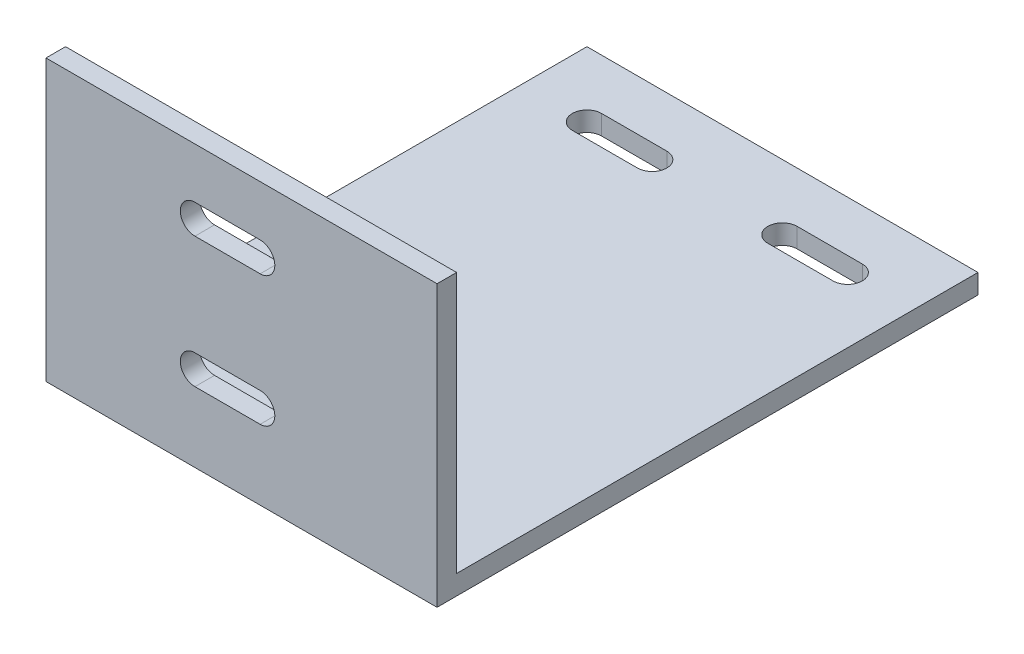
ISO-10303-21;
HEADER;
FILE_DESCRIPTION(('STEP AP214'),'2;1');
FILE_NAME('part.step','',(''),(''),'','','');
FILE_SCHEMA(('AUTOMOTIVE_DESIGN { 1 0 10303 214 1 1 1 1 }'));
ENDSEC;
DATA;
#1=APPLICATION_CONTEXT('core data for automotive mechanical design processes');
#2=APPLICATION_PROTOCOL_DEFINITION('international standard','automotive_design',2000,#1);
#3=PRODUCT_CONTEXT('',#1,'mechanical');
#4=PRODUCT('Part','Part','',(#3));
#5=PRODUCT_RELATED_PRODUCT_CATEGORY('part','',(#4));
#6=PRODUCT_DEFINITION_FORMATION('','',#4);
#7=PRODUCT_DEFINITION_CONTEXT('part definition',#1,'design');
#8=PRODUCT_DEFINITION('design','',#6,#7);
#9=PRODUCT_DEFINITION_SHAPE('','',#8);
#10=(LENGTH_UNIT() NAMED_UNIT(*) SI_UNIT(.MILLI.,.METRE.));
#11=(NAMED_UNIT(*) PLANE_ANGLE_UNIT() SI_UNIT($,.RADIAN.));
#12=(NAMED_UNIT(*) SI_UNIT($,.STERADIAN.) SOLID_ANGLE_UNIT());
#13=UNCERTAINTY_MEASURE_WITH_UNIT(LENGTH_MEASURE(1.E-05),#10,'distance_accuracy_value','');
#14=(GEOMETRIC_REPRESENTATION_CONTEXT(3) GLOBAL_UNCERTAINTY_ASSIGNED_CONTEXT((#13)) GLOBAL_UNIT_ASSIGNED_CONTEXT((#10,
#11,#12)) REPRESENTATION_CONTEXT('',''));
#15=CARTESIAN_POINT('',(0.,0.,0.));
#16=DIRECTION('',(0.,0.,1.));
#17=DIRECTION('',(1.,0.,0.));
#18=AXIS2_PLACEMENT_3D('',#15,#16,#17);
#19=CARTESIAN_POINT('',(-55.71281292085,37.,-144.0000000001));
#20=DIRECTION('',(0.,-1.,0.));
#21=DIRECTION('',(-1.,0.,0.));
#22=AXIS2_PLACEMENT_3D('',#19,#20,#21);
#23=PLANE('',#22);
#24=DIRECTION('',(1.,0.,-4.806710585115E-13));
#25=VECTOR('',#24,1.);
#26=CARTESIAN_POINT('',(-15.71281292093,37.,-119.5000000001));
#27=LINE('',#26,#25);
#28=CARTESIAN_POINT('',(24.287187079079,37.,-119.5));
#29=VERTEX_POINT('',#28);
#30=CARTESIAN_POINT('',(44.287187079084,37.,-119.4999999999));
#31=VERTEX_POINT('',#30);
#32=EDGE_CURVE('E238',#29,#31,#27,.T.);
#33=ORIENTED_EDGE('',*,*,#32,.F.);
#34=CARTESIAN_POINT('',(24.287187078964,37.,-123.9999999997));
#35=DIRECTION('',(0.,1.,0.));
#36=DIRECTION('',(-4.806710585115E-13,0.,-1.));
#37=AXIS2_PLACEMENT_3D('',#34,#35,#36);
#38=CIRCLE('',#37,4.5);
#39=CARTESIAN_POINT('',(24.287187079204,37.,-128.5000000004));
#40=VERTEX_POINT('',#39);
#41=EDGE_CURVE('E235',#40,#29,#38,.T.);
#42=ORIENTED_EDGE('',*,*,#41,.F.);
#43=DIRECTION('',(-1.,0.,4.806710585115E-13));
#44=VECTOR('',#43,1.);
#45=CARTESIAN_POINT('',(-5.712812921062,37.,-128.4999999995));
#46=LINE('',#45,#44);
#47=CARTESIAN_POINT('',(44.287187079209,37.,-128.5000000003));
#48=VERTEX_POINT('',#47);
#49=EDGE_CURVE('E266',#48,#40,#46,.T.);
#50=ORIENTED_EDGE('',*,*,#49,.F.);
#51=CARTESIAN_POINT('',(44.287187078969,37.,-123.9999999996));
#52=DIRECTION('',(0.,1.,0.));
#53=DIRECTION('',(4.806710585115E-13,0.,1.));
#54=AXIS2_PLACEMENT_3D('',#51,#52,#53);
#55=CIRCLE('',#54,4.5);
#56=EDGE_CURVE('E267',#31,#48,#55,.T.);
#57=ORIENTED_EDGE('',*,*,#56,.F.);
#58=EDGE_LOOP('',(#33,#42,#50,#57));
#59=FACE_BOUND('',#58,.T.);
#60=DIRECTION('',(1.,0.,-4.806710585115E-13));
#61=VECTOR('',#60,1.);
#62=CARTESIAN_POINT('',(-45.71281292084,37.,-119.5000000001));
#63=LINE('',#62,#61);
#64=CARTESIAN_POINT('',(-35.71281292083,37.,-119.5000000001));
#65=VERTEX_POINT('',#64);
#66=CARTESIAN_POINT('',(-15.71281292093,37.,-119.5000000001));
#67=VERTEX_POINT('',#66);
#68=EDGE_CURVE('E21',#65,#67,#63,.T.);
#69=ORIENTED_EDGE('',*,*,#68,.F.);
#70=CARTESIAN_POINT('',(-35.71281292095,37.,-123.9999999998));
#71=DIRECTION('',(0.,1.,0.));
#72=DIRECTION('',(-4.806710585115E-13,0.,-1.));
#73=AXIS2_PLACEMENT_3D('',#70,#71,#72);
#74=CIRCLE('',#73,4.5);
#75=CARTESIAN_POINT('',(-35.71281292107,37.,-128.4999999995));
#76=VERTEX_POINT('',#75);
#77=EDGE_CURVE('E48',#76,#65,#74,.T.);
#78=ORIENTED_EDGE('',*,*,#77,.F.);
#79=DIRECTION('',(-1.,0.,4.806710585115E-13));
#80=VECTOR('',#79,1.);
#81=CARTESIAN_POINT('',(-35.71281292107,37.,-128.4999999995));
#82=LINE('',#81,#80);
#83=CARTESIAN_POINT('',(-15.71281292106,37.,-128.4999999995));
#84=VERTEX_POINT('',#83);
#85=EDGE_CURVE('E283',#84,#76,#82,.T.);
#86=ORIENTED_EDGE('',*,*,#85,.F.);
#87=CARTESIAN_POINT('',(-15.71281292095,37.,-123.9999999998));
#88=DIRECTION('',(0.,1.,0.));
#89=DIRECTION('',(4.806710585115E-13,0.,1.));
#90=AXIS2_PLACEMENT_3D('',#87,#88,#89);
#91=CIRCLE('',#90,4.5);
#92=EDGE_CURVE('E275',#67,#84,#91,.T.);
#93=ORIENTED_EDGE('',*,*,#92,.F.);
#94=EDGE_LOOP('',(#69,#78,#86,#93));
#95=FACE_BOUND('',#94,.T.);
#96=DIRECTION('',(-5.186961971049E-13,0.,1.));
#97=VECTOR('',#96,1.);
#98=CARTESIAN_POINT('',(64.287187078983,37.,-143.9999999998));
#99=LINE('',#98,#97);
#100=CARTESIAN_POINT('',(64.287187078982,37.,-143.9999999998));
#101=VERTEX_POINT('',#100);
#102=CARTESIAN_POINT('',(64.287187078899,37.,16.000000000441));
#103=VERTEX_POINT('',#102);
#104=EDGE_CURVE('E327',#101,#103,#99,.T.);
#105=ORIENTED_EDGE('',*,*,#104,.F.);
#106=DIRECTION('',(1.,0.,-4.806710585115E-13));
#107=VECTOR('',#106,1.);
#108=CARTESIAN_POINT('',(-55.71281292085,37.,-144.0000000001));
#109=LINE('',#108,#107);
#110=CARTESIAN_POINT('',(-55.71281292085,37.,-144.0000000001));
#111=VERTEX_POINT('',#110);
#112=EDGE_CURVE('E11',#111,#101,#109,.T.);
#113=ORIENTED_EDGE('',*,*,#112,.F.);
#114=DIRECTION('',(-1.662836535132E-13,0.,1.));
#115=VECTOR('',#114,1.);
#116=CARTESIAN_POINT('',(-55.71281292085,37.,-144.0000000001));
#117=LINE('',#116,#115);
#118=CARTESIAN_POINT('',(-55.71281292087,37.,-30.));
#119=VERTEX_POINT('',#118);
#120=EDGE_CURVE('E714',#111,#119,#117,.T.);
#121=ORIENTED_EDGE('',*,*,#120,.T.);
#122=DIRECTION('',(4.806710585115E-13,0.,1.));
#123=VECTOR('',#122,1.);
#124=CARTESIAN_POINT('',(-55.71281292085,37.,-104.0000000001));
#125=LINE('',#124,#123);
#126=CARTESIAN_POINT('',(-55.71281292093,37.,16.000000000171));
#127=VERTEX_POINT('',#126);
#128=EDGE_CURVE('E320',#119,#127,#125,.T.);
#129=ORIENTED_EDGE('',*,*,#128,.T.);
#130=DIRECTION('',(1.,0.,-4.806710585115E-13));
#131=VECTOR('',#130,1.);
#132=CARTESIAN_POINT('',(-55.71281292093,37.,16.000000000171));
#133=LINE('',#132,#131);
#134=EDGE_CURVE('E354',#127,#103,#133,.T.);
#135=ORIENTED_EDGE('',*,*,#134,.T.);
#136=EDGE_LOOP('',(#105,#113,#121,#129,#135));
#137=FACE_BOUND('',#136,.T.);
#138=ADVANCED_FACE('F17',(#59,#95,#137),#23,.F.);
#139=CARTESIAN_POINT('',(-55.71281292085,37.,-144.0000000001));
#140=DIRECTION('',(4.806710585115E-13,0.,1.));
#141=DIRECTION('',(1.,0.,-4.806710585115E-13));
#142=AXIS2_PLACEMENT_3D('',#139,#140,#141);
#143=PLANE('',#142);
#144=DIRECTION('',(0.,-1.,0.));
#145=VECTOR('',#144,1.);
#146=CARTESIAN_POINT('',(-55.71281292085,37.,-144.0000000001));
#147=LINE('',#146,#145);
#148=CARTESIAN_POINT('',(-55.71281292085,31.,-144.0000000001));
#149=VERTEX_POINT('',#148);
#150=EDGE_CURVE('E326',#111,#149,#147,.T.);
#151=ORIENTED_EDGE('',*,*,#150,.F.);
#152=ORIENTED_EDGE('',*,*,#112,.T.);
#153=DIRECTION('',(0.,-1.,0.));
#154=VECTOR('',#153,1.);
#155=CARTESIAN_POINT('',(64.287187078982,37.,-143.9999999998));
#156=LINE('',#155,#154);
#157=CARTESIAN_POINT('',(64.287187078982,31.,-143.9999999998));
#158=VERTEX_POINT('',#157);
#159=EDGE_CURVE('E331',#101,#158,#156,.T.);
#160=ORIENTED_EDGE('',*,*,#159,.T.);
#161=DIRECTION('',(1.,0.,-4.806710585115E-13));
#162=VECTOR('',#161,1.);
#163=CARTESIAN_POINT('',(-55.71281292085,31.,-144.0000000001));
#164=LINE('',#163,#162);
#165=EDGE_CURVE('E472',#149,#158,#164,.T.);
#166=ORIENTED_EDGE('',*,*,#165,.F.);
#167=EDGE_LOOP('',(#151,#152,#160,#166));
#168=FACE_BOUND('',#167,.T.);
#169=ADVANCED_FACE('F19',(#168),#143,.F.);
#170=CARTESIAN_POINT('',(-35.71281292083,30.99,-119.5000000001));
#171=DIRECTION('',(4.806710585115E-13,0.,1.));
#172=DIRECTION('',(1.,0.,-4.806710585115E-13));
#173=AXIS2_PLACEMENT_3D('',#170,#171,#172);
#174=PLANE('',#173);
#175=DIRECTION('',(1.,0.,-4.806710585115E-13));
#176=VECTOR('',#175,1.);
#177=CARTESIAN_POINT('',(-45.71281292084,31.,-119.5000000001));
#178=LINE('',#177,#176);
#179=CARTESIAN_POINT('',(-35.71281292083,31.,-119.5000000001));
#180=VERTEX_POINT('',#179);
#181=CARTESIAN_POINT('',(-15.71281292093,31.,-119.5000000001));
#182=VERTEX_POINT('',#181);
#183=EDGE_CURVE('E397',#180,#182,#178,.T.);
#184=ORIENTED_EDGE('',*,*,#183,.F.);
#185=DIRECTION('',(0.,1.,0.));
#186=VECTOR('',#185,1.);
#187=CARTESIAN_POINT('',(-35.71281292083,30.99,-119.5000000001));
#188=LINE('',#187,#186);
#189=EDGE_CURVE('E291',#180,#65,#188,.T.);
#190=ORIENTED_EDGE('',*,*,#189,.T.);
#191=ORIENTED_EDGE('',*,*,#68,.T.);
#192=DIRECTION('',(0.,1.,0.));
#193=VECTOR('',#192,1.);
#194=CARTESIAN_POINT('',(-15.71281292093,30.99,-119.5000000001));
#195=LINE('',#194,#193);
#196=EDGE_CURVE('E274',#182,#67,#195,.T.);
#197=ORIENTED_EDGE('',*,*,#196,.F.);
#198=EDGE_LOOP('',(#184,#190,#191,#197));
#199=FACE_BOUND('',#198,.T.);
#200=ADVANCED_FACE('F299',(#199),#174,.F.);
#201=CARTESIAN_POINT('',(-35.71281292095,30.99,-123.9999999998));
#202=DIRECTION('',(0.,-1.,0.));
#203=DIRECTION('',(-4.806710585115E-13,0.,-1.));
#204=AXIS2_PLACEMENT_3D('',#201,#202,#203);
#205=CYLINDRICAL_SURFACE('',#204,4.5);
#206=CARTESIAN_POINT('',(-35.71281292095,31.,-123.9999999998));
#207=DIRECTION('',(0.,1.,0.));
#208=DIRECTION('',(-4.806710585115E-13,0.,-1.));
#209=AXIS2_PLACEMENT_3D('',#206,#207,#208);
#210=CIRCLE('',#209,4.5);
#211=CARTESIAN_POINT('',(-35.71281292107,31.,-128.4999999995));
#212=VERTEX_POINT('',#211);
#213=EDGE_CURVE('E400',#212,#180,#210,.T.);
#214=ORIENTED_EDGE('',*,*,#213,.F.);
#215=DIRECTION('',(0.,1.,0.));
#216=VECTOR('',#215,1.);
#217=CARTESIAN_POINT('',(-35.71281292107,30.99,-128.4999999995));
#218=LINE('',#217,#216);
#219=EDGE_CURVE('E287',#212,#76,#218,.T.);
#220=ORIENTED_EDGE('',*,*,#219,.T.);
#221=ORIENTED_EDGE('',*,*,#77,.T.);
#222=ORIENTED_EDGE('',*,*,#189,.F.);
#223=EDGE_LOOP('',(#214,#220,#221,#222));
#224=FACE_BOUND('',#223,.T.);
#225=ADVANCED_FACE('F498',(#224),#205,.F.);
#226=CARTESIAN_POINT('',(-15.71281292106,30.99,-128.4999999995));
#227=DIRECTION('',(-4.806710585115E-13,0.,-1.));
#228=DIRECTION('',(-1.,0.,4.806710585115E-13));
#229=AXIS2_PLACEMENT_3D('',#226,#227,#228);
#230=PLANE('',#229);
#231=DIRECTION('',(-1.,0.,4.806710585115E-13));
#232=VECTOR('',#231,1.);
#233=CARTESIAN_POINT('',(-35.71281292107,31.,-128.4999999995));
#234=LINE('',#233,#232);
#235=CARTESIAN_POINT('',(-15.71281292106,31.,-128.4999999995));
#236=VERTEX_POINT('',#235);
#237=EDGE_CURVE('E444',#236,#212,#234,.T.);
#238=ORIENTED_EDGE('',*,*,#237,.F.);
#239=DIRECTION('',(0.,1.,0.));
#240=VECTOR('',#239,1.);
#241=CARTESIAN_POINT('',(-15.71281292106,30.99,-128.4999999995));
#242=LINE('',#241,#240);
#243=EDGE_CURVE('E279',#236,#84,#242,.T.);
#244=ORIENTED_EDGE('',*,*,#243,.T.);
#245=ORIENTED_EDGE('',*,*,#85,.T.);
#246=ORIENTED_EDGE('',*,*,#219,.F.);
#247=EDGE_LOOP('',(#238,#244,#245,#246));
#248=FACE_BOUND('',#247,.T.);
#249=ADVANCED_FACE('F495',(#248),#230,.F.);
#250=CARTESIAN_POINT('',(-15.71281292095,30.99,-123.9999999998));
#251=DIRECTION('',(0.,-1.,0.));
#252=DIRECTION('',(4.806710585115E-13,0.,1.));
#253=AXIS2_PLACEMENT_3D('',#250,#251,#252);
#254=CYLINDRICAL_SURFACE('',#253,4.5);
#255=CARTESIAN_POINT('',(-15.71281292095,31.,-123.9999999998));
#256=DIRECTION('',(0.,1.,0.));
#257=DIRECTION('',(4.806710585115E-13,0.,1.));
#258=AXIS2_PLACEMENT_3D('',#255,#256,#257);
#259=CIRCLE('',#258,4.5);
#260=EDGE_CURVE('E307',#182,#236,#259,.T.);
#261=ORIENTED_EDGE('',*,*,#260,.F.);
#262=ORIENTED_EDGE('',*,*,#196,.T.);
#263=ORIENTED_EDGE('',*,*,#92,.T.);
#264=ORIENTED_EDGE('',*,*,#243,.F.);
#265=EDGE_LOOP('',(#261,#262,#263,#264));
#266=FACE_BOUND('',#265,.T.);
#267=ADVANCED_FACE('F305',(#266),#254,.F.);
#268=CARTESIAN_POINT('',(24.287187079079,30.99,-119.5));
#269=DIRECTION('',(4.806710585115E-13,0.,1.));
#270=DIRECTION('',(1.,0.,-4.806710585115E-13));
#271=AXIS2_PLACEMENT_3D('',#268,#269,#270);
#272=PLANE('',#271);
#273=DIRECTION('',(1.,0.,-4.806710585115E-13));
#274=VECTOR('',#273,1.);
#275=CARTESIAN_POINT('',(-15.71281292093,31.,-119.5000000001));
#276=LINE('',#275,#274);
#277=CARTESIAN_POINT('',(24.287187079079,31.,-119.5));
#278=VERTEX_POINT('',#277);
#279=CARTESIAN_POINT('',(44.287187079084,31.,-119.4999999999));
#280=VERTEX_POINT('',#279);
#281=EDGE_CURVE('E241',#278,#280,#276,.T.);
#282=ORIENTED_EDGE('',*,*,#281,.F.);
#283=DIRECTION('',(0.,1.,0.));
#284=VECTOR('',#283,1.);
#285=CARTESIAN_POINT('',(24.287187079079,30.99,-119.5));
#286=LINE('',#285,#284);
#287=EDGE_CURVE('E228',#278,#29,#286,.T.);
#288=ORIENTED_EDGE('',*,*,#287,.T.);
#289=ORIENTED_EDGE('',*,*,#32,.T.);
#290=DIRECTION('',(0.,1.,0.));
#291=VECTOR('',#290,1.);
#292=CARTESIAN_POINT('',(44.287187079084,30.99,-119.4999999999));
#293=LINE('',#292,#291);
#294=EDGE_CURVE('E244',#280,#31,#293,.T.);
#295=ORIENTED_EDGE('',*,*,#294,.F.);
#296=EDGE_LOOP('',(#282,#288,#289,#295));
#297=FACE_BOUND('',#296,.T.);
#298=ADVANCED_FACE('F242',(#297),#272,.F.);
#299=CARTESIAN_POINT('',(24.287187078964,30.99,-123.9999999997));
#300=DIRECTION('',(0.,-1.,0.));
#301=DIRECTION('',(-4.806710585115E-13,0.,-1.));
#302=AXIS2_PLACEMENT_3D('',#299,#300,#301);
#303=CYLINDRICAL_SURFACE('',#302,4.5);
#304=CARTESIAN_POINT('',(24.287187078964,31.,-123.9999999997));
#305=DIRECTION('',(0.,1.,0.));
#306=DIRECTION('',(-4.806710585115E-13,0.,-1.));
#307=AXIS2_PLACEMENT_3D('',#304,#305,#306);
#308=CIRCLE('',#307,4.5);
#309=CARTESIAN_POINT('',(24.287187079204,31.,-128.5000000004));
#310=VERTEX_POINT('',#309);
#311=EDGE_CURVE('E233',#310,#278,#308,.T.);
#312=ORIENTED_EDGE('',*,*,#311,.F.);
#313=DIRECTION('',(0.,1.,0.));
#314=VECTOR('',#313,1.);
#315=CARTESIAN_POINT('',(24.287187079204,30.99,-128.5000000004));
#316=LINE('',#315,#314);
#317=EDGE_CURVE('E270',#310,#40,#316,.T.);
#318=ORIENTED_EDGE('',*,*,#317,.T.);
#319=ORIENTED_EDGE('',*,*,#41,.T.);
#320=ORIENTED_EDGE('',*,*,#287,.F.);
#321=EDGE_LOOP('',(#312,#318,#319,#320));
#322=FACE_BOUND('',#321,.T.);
#323=ADVANCED_FACE('F230',(#322),#303,.F.);
#324=CARTESIAN_POINT('',(44.287187079209,30.99,-128.5000000003));
#325=DIRECTION('',(-4.806710585115E-13,0.,-1.));
#326=DIRECTION('',(-1.,0.,4.806710585115E-13));
#327=AXIS2_PLACEMENT_3D('',#324,#325,#326);
#328=PLANE('',#327);
#329=DIRECTION('',(-1.,0.,4.806710585115E-13));
#330=VECTOR('',#329,1.);
#331=CARTESIAN_POINT('',(-5.712812921062,31.,-128.4999999995));
#332=LINE('',#331,#330);
#333=CARTESIAN_POINT('',(44.287187079209,31.,-128.5000000003));
#334=VERTEX_POINT('',#333);
#335=EDGE_CURVE('E253',#334,#310,#332,.T.);
#336=ORIENTED_EDGE('',*,*,#335,.F.);
#337=DIRECTION('',(0.,1.,0.));
#338=VECTOR('',#337,1.);
#339=CARTESIAN_POINT('',(44.287187079209,30.99,-128.5000000003));
#340=LINE('',#339,#338);
#341=EDGE_CURVE('E262',#334,#48,#340,.T.);
#342=ORIENTED_EDGE('',*,*,#341,.T.);
#343=ORIENTED_EDGE('',*,*,#49,.T.);
#344=ORIENTED_EDGE('',*,*,#317,.F.);
#345=EDGE_LOOP('',(#336,#342,#343,#344));
#346=FACE_BOUND('',#345,.T.);
#347=ADVANCED_FACE('F482',(#346),#328,.F.);
#348=CARTESIAN_POINT('',(44.287187078969,30.99,-123.9999999996));
#349=DIRECTION('',(0.,-1.,0.));
#350=DIRECTION('',(4.806710585115E-13,0.,1.));
#351=AXIS2_PLACEMENT_3D('',#348,#349,#350);
#352=CYLINDRICAL_SURFACE('',#351,4.5);
#353=CARTESIAN_POINT('',(44.287187078969,31.,-123.9999999996));
#354=DIRECTION('',(0.,1.,0.));
#355=DIRECTION('',(4.806710585115E-13,0.,1.));
#356=AXIS2_PLACEMENT_3D('',#353,#354,#355);
#357=CIRCLE('',#356,4.5);
#358=EDGE_CURVE('E258',#280,#334,#357,.T.);
#359=ORIENTED_EDGE('',*,*,#358,.F.);
#360=ORIENTED_EDGE('',*,*,#294,.T.);
#361=ORIENTED_EDGE('',*,*,#56,.T.);
#362=ORIENTED_EDGE('',*,*,#341,.F.);
#363=EDGE_LOOP('',(#359,#360,#361,#362));
#364=FACE_BOUND('',#363,.T.);
#365=ADVANCED_FACE('F479',(#364),#352,.F.);
#366=CARTESIAN_POINT('',(-55.71281292085,31.,-144.0000000001));
#367=DIRECTION('',(0.,-1.,0.));
#368=DIRECTION('',(-1.,0.,0.));
#369=AXIS2_PLACEMENT_3D('',#366,#367,#368);
#370=PLANE('',#369);
#371=ORIENTED_EDGE('',*,*,#358,.T.);
#372=ORIENTED_EDGE('',*,*,#335,.T.);
#373=ORIENTED_EDGE('',*,*,#311,.T.);
#374=ORIENTED_EDGE('',*,*,#281,.T.);
#375=EDGE_LOOP('',(#371,#372,#373,#374));
#376=FACE_BOUND('',#375,.T.);
#377=ORIENTED_EDGE('',*,*,#260,.T.);
#378=ORIENTED_EDGE('',*,*,#237,.T.);
#379=ORIENTED_EDGE('',*,*,#213,.T.);
#380=ORIENTED_EDGE('',*,*,#183,.T.);
#381=EDGE_LOOP('',(#377,#378,#379,#380));
#382=FACE_BOUND('',#381,.T.);
#383=DIRECTION('',(-4.806710585115E-13,0.,-1.));
#384=VECTOR('',#383,1.);
#385=CARTESIAN_POINT('',(64.287187079171,31.,-18.00000000024));
#386=LINE('',#385,#384);
#387=CARTESIAN_POINT('',(64.287187079146,31.,-70.));
#388=VERTEX_POINT('',#387);
#389=EDGE_CURVE('E418',#388,#158,#386,.T.);
#390=ORIENTED_EDGE('',*,*,#389,.F.);
#391=DIRECTION('',(0.,0.,1.));
#392=VECTOR('',#391,1.);
#393=CARTESIAN_POINT('',(64.287187079018,31.,-70.));
#394=LINE('',#393,#392);
#395=CARTESIAN_POINT('',(64.287187079146,31.,-30.));
#396=VERTEX_POINT('',#395);
#397=EDGE_CURVE('E415',#388,#396,#394,.T.);
#398=ORIENTED_EDGE('',*,*,#397,.T.);
#399=DIRECTION('',(-4.806710585115E-13,0.,-1.));
#400=VECTOR('',#399,1.);
#401=CARTESIAN_POINT('',(64.287187079171,31.,21.999999999754));
#402=LINE('',#401,#400);
#403=CARTESIAN_POINT('',(64.287187079171,31.,21.999999999753));
#404=VERTEX_POINT('',#403);
#405=EDGE_CURVE('E419',#404,#396,#402,.T.);
#406=ORIENTED_EDGE('',*,*,#405,.F.);
#407=DIRECTION('',(1.,0.,-4.806710585115E-13));
#408=VECTOR('',#407,1.);
#409=CARTESIAN_POINT('',(-55.71281292102,31.,22.000000000424));
#410=LINE('',#409,#408);
#411=CARTESIAN_POINT('',(-55.71281292102,31.,22.000000000424));
#412=VERTEX_POINT('',#411);
#413=EDGE_CURVE('E469',#412,#404,#410,.T.);
#414=ORIENTED_EDGE('',*,*,#413,.F.);
#415=DIRECTION('',(1.002642413539E-12,0.,-1.));
#416=VECTOR('',#415,1.);
#417=CARTESIAN_POINT('',(-55.71281292102,31.,22.000000000423));
#418=LINE('',#417,#416);
#419=EDGE_CURVE('E321',#412,#149,#418,.T.);
#420=ORIENTED_EDGE('',*,*,#419,.T.);
#421=ORIENTED_EDGE('',*,*,#165,.T.);
#422=EDGE_LOOP('',(#390,#398,#406,#414,#420,#421));
#423=FACE_BOUND('',#422,.T.);
#424=ADVANCED_FACE('F250',(#376,#382,#423),#370,.T.);
#425=CARTESIAN_POINT('',(-55.71281292102,37.,22.000000000424));
#426=DIRECTION('',(4.806710585115E-13,0.,1.));
#427=DIRECTION('',(1.,0.,-4.806710585115E-13));
#428=AXIS2_PLACEMENT_3D('',#425,#426,#427);
#429=PLANE('',#428);
#430=CARTESIAN_POINT('',(-9.999999999818,57.,21.999999999612));
#431=DIRECTION('',(4.806710585115E-13,0.,1.));
#432=DIRECTION('',(0.,1.,0.));
#433=AXIS2_PLACEMENT_3D('',#430,#431,#432);
#434=CIRCLE('',#433,4.5);
#435=CARTESIAN_POINT('',(-9.999999999818,61.5,21.999999999611));
#436=VERTEX_POINT('',#435);
#437=CARTESIAN_POINT('',(-9.999999999818,52.5,21.999999999611));
#438=VERTEX_POINT('',#437);
#439=EDGE_CURVE('E390',#436,#438,#434,.T.);
#440=ORIENTED_EDGE('',*,*,#439,.F.);
#441=DIRECTION('',(1.,0.,-4.806710585115E-13));
#442=VECTOR('',#441,1.);
#443=CARTESIAN_POINT('',(-22.85640646046,61.5,22.000000000032));
#444=LINE('',#443,#442);
#445=CARTESIAN_POINT('',(10.000000000186,61.5,21.999999999665));
#446=VERTEX_POINT('',#445);
#447=EDGE_CURVE('E408',#436,#446,#444,.T.);
#448=ORIENTED_EDGE('',*,*,#447,.T.);
#449=CARTESIAN_POINT('',(10.000000000187,57.,21.999999999665));
#450=DIRECTION('',(4.806710585115E-13,0.,1.));
#451=DIRECTION('',(0.,-1.,0.));
#452=AXIS2_PLACEMENT_3D('',#449,#450,#451);
#453=CIRCLE('',#452,4.5);
#454=CARTESIAN_POINT('',(10.000000000186,52.5,21.999999999665));
#455=VERTEX_POINT('',#454);
#456=EDGE_CURVE('E365',#455,#446,#453,.T.);
#457=ORIENTED_EDGE('',*,*,#456,.F.);
#458=DIRECTION('',(-1.,0.,4.806710585115E-13));
#459=VECTOR('',#458,1.);
#460=CARTESIAN_POINT('',(-32.85640646046,52.5,22.000000000005));
#461=LINE('',#460,#459);
#462=EDGE_CURVE('E368',#455,#438,#461,.T.);
#463=ORIENTED_EDGE('',*,*,#462,.T.);
#464=EDGE_LOOP('',(#440,#448,#457,#463));
#465=FACE_BOUND('',#464,.T.);
#466=CARTESIAN_POINT('',(-9.999999999818,97.,21.999999999612));
#467=DIRECTION('',(4.806710585115E-13,0.,1.));
#468=DIRECTION('',(0.,1.,0.));
#469=AXIS2_PLACEMENT_3D('',#466,#467,#468);
#470=CIRCLE('',#469,4.5);
#471=CARTESIAN_POINT('',(-9.999999999818,101.5,21.999999999611));
#472=VERTEX_POINT('',#471);
#473=CARTESIAN_POINT('',(-9.999999999818,92.5,21.999999999611));
#474=VERTEX_POINT('',#473);
#475=EDGE_CURVE('E378',#472,#474,#470,.T.);
#476=ORIENTED_EDGE('',*,*,#475,.F.);
#477=DIRECTION('',(1.,0.,-4.806710585115E-13));
#478=VECTOR('',#477,1.);
#479=CARTESIAN_POINT('',(-22.85640646046,101.5,22.000000000032));
#480=LINE('',#479,#478);
#481=CARTESIAN_POINT('',(10.000000000186,101.5,21.999999999665));
#482=VERTEX_POINT('',#481);
#483=EDGE_CURVE('E347',#472,#482,#480,.T.);
#484=ORIENTED_EDGE('',*,*,#483,.T.);
#485=CARTESIAN_POINT('',(10.000000000187,97.,21.999999999665));
#486=DIRECTION('',(4.806710585115E-13,0.,1.));
#487=DIRECTION('',(0.,-1.,0.));
#488=AXIS2_PLACEMENT_3D('',#485,#486,#487);
#489=CIRCLE('',#488,4.5);
#490=CARTESIAN_POINT('',(10.000000000186,92.5,21.999999999665));
#491=VERTEX_POINT('',#490);
#492=EDGE_CURVE('E440',#491,#482,#489,.T.);
#493=ORIENTED_EDGE('',*,*,#492,.F.);
#494=DIRECTION('',(-1.,0.,4.806710585115E-13));
#495=VECTOR('',#494,1.);
#496=CARTESIAN_POINT('',(-32.85640646046,92.5,22.000000000005));
#497=LINE('',#496,#495);
#498=EDGE_CURVE('E447',#491,#474,#497,.T.);
#499=ORIENTED_EDGE('',*,*,#498,.T.);
#500=EDGE_LOOP('',(#476,#484,#493,#499));
#501=FACE_BOUND('',#500,.T.);
#502=ORIENTED_EDGE('',*,*,#413,.T.);
#503=DIRECTION('',(0.,1.,0.));
#504=VECTOR('',#503,1.);
#505=CARTESIAN_POINT('',(64.287187079171,31.,21.999999999754));
#506=LINE('',#505,#504);
#507=CARTESIAN_POINT('',(64.287187079171,117.,21.999999999753));
#508=VERTEX_POINT('',#507);
#509=EDGE_CURVE('E454',#404,#508,#506,.T.);
#510=ORIENTED_EDGE('',*,*,#509,.T.);
#511=DIRECTION('',(1.,0.,-4.806710585115E-13));
#512=VECTOR('',#511,1.);
#513=CARTESIAN_POINT('',(-55.71281292102,117.,22.000000000424));
#514=LINE('',#513,#512);
#515=CARTESIAN_POINT('',(-55.71281292102,117.,22.000000000424));
#516=VERTEX_POINT('',#515);
#517=EDGE_CURVE('E330',#516,#508,#514,.T.);
#518=ORIENTED_EDGE('',*,*,#517,.F.);
#519=DIRECTION('',(0.,-1.,0.));
#520=VECTOR('',#519,1.);
#521=CARTESIAN_POINT('',(-55.71281292102,117.,22.000000000424));
#522=LINE('',#521,#520);
#523=EDGE_CURVE('E325',#516,#412,#522,.T.);
#524=ORIENTED_EDGE('',*,*,#523,.T.);
#525=EDGE_LOOP('',(#502,#510,#518,#524));
#526=FACE_BOUND('',#525,.T.);
#527=ADVANCED_FACE('F562',(#465,#501,#526),#429,.T.);
#528=CARTESIAN_POINT('',(-55.71281292093,117.,16.000000000171));
#529=DIRECTION('',(0.,-1.,0.));
#530=DIRECTION('',(-1.,0.,0.));
#531=AXIS2_PLACEMENT_3D('',#528,#529,#530);
#532=PLANE('',#531);
#533=DIRECTION('',(1.,0.,-4.806710585115E-13));
#534=VECTOR('',#533,1.);
#535=CARTESIAN_POINT('',(-55.71281292093,117.,16.000000000171));
#536=LINE('',#535,#534);
#537=CARTESIAN_POINT('',(-55.71281292093,117.,16.000000000171));
#538=VERTEX_POINT('',#537);
#539=CARTESIAN_POINT('',(64.287187078899,117.,16.000000000441));
#540=VERTEX_POINT('',#539);
#541=EDGE_CURVE('E317',#538,#540,#536,.T.);
#542=ORIENTED_EDGE('',*,*,#541,.F.);
#543=DIRECTION('',(4.806710585115E-13,0.,1.));
#544=VECTOR('',#543,1.);
#545=CARTESIAN_POINT('',(-55.71281292093,117.,16.000000000171));
#546=LINE('',#545,#544);
#547=EDGE_CURVE('E335',#538,#516,#546,.T.);
#548=ORIENTED_EDGE('',*,*,#547,.T.);
#549=ORIENTED_EDGE('',*,*,#517,.T.);
#550=DIRECTION('',(4.806710585115E-13,0.,1.));
#551=VECTOR('',#550,1.);
#552=CARTESIAN_POINT('',(64.287187078899,117.,16.000000000441));
#553=LINE('',#552,#551);
#554=EDGE_CURVE('E450',#540,#508,#553,.T.);
#555=ORIENTED_EDGE('',*,*,#554,.F.);
#556=EDGE_LOOP('',(#542,#548,#549,#555));
#557=FACE_BOUND('',#556,.T.);
#558=ADVANCED_FACE('F570',(#557),#532,.F.);
#559=CARTESIAN_POINT('',(64.287187078983,37.,-143.9999999998));
#560=DIRECTION('',(1.,0.,-4.806988140871E-13));
#561=DIRECTION('',(-4.806988140871E-13,0.,-1.));
#562=AXIS2_PLACEMENT_3D('',#559,#560,#561);
#563=PLANE('',#562);
#564=DIRECTION('',(0.,-1.,0.));
#565=VECTOR('',#564,1.);
#566=CARTESIAN_POINT('',(64.287187078899,117.,16.000000000441));
#567=LINE('',#566,#565);
#568=EDGE_CURVE('E315',#540,#103,#567,.T.);
#569=ORIENTED_EDGE('',*,*,#568,.F.);
#570=ORIENTED_EDGE('',*,*,#554,.T.);
#571=ORIENTED_EDGE('',*,*,#509,.F.);
#572=ORIENTED_EDGE('',*,*,#405,.T.);
#573=ORIENTED_EDGE('',*,*,#397,.F.);
#574=ORIENTED_EDGE('',*,*,#389,.T.);
#575=ORIENTED_EDGE('',*,*,#159,.F.);
#576=ORIENTED_EDGE('',*,*,#104,.T.);
#577=EDGE_LOOP('',(#569,#570,#571,#572,#573,#574,#575,#576));
#578=FACE_BOUND('',#577,.T.);
#579=ADVANCED_FACE('F579',(#578),#563,.T.);
#580=CARTESIAN_POINT('',(-9.99999999985,92.5,15.989999999601));
#581=DIRECTION('',(0.,-1.,0.));
#582=DIRECTION('',(-1.,0.,0.));
#583=AXIS2_PLACEMENT_3D('',#580,#581,#582);
#584=PLANE('',#583);
#585=DIRECTION('',(-1.,0.,4.806710585115E-13));
#586=VECTOR('',#585,1.);
#587=CARTESIAN_POINT('',(-32.85640646038,92.5,15.999999999753));
#588=LINE('',#587,#586);
#589=CARTESIAN_POINT('',(9.999999999915,92.5,16.000000000352));
#590=VERTEX_POINT('',#589);
#591=CARTESIAN_POINT('',(-9.999999999994,92.5,16.000000000325));
#592=VERTEX_POINT('',#591);
#593=EDGE_CURVE('E349',#590,#592,#588,.T.);
#594=ORIENTED_EDGE('',*,*,#593,.T.);
#595=DIRECTION('',(4.806710585115E-13,0.,1.));
#596=VECTOR('',#595,1.);
#597=CARTESIAN_POINT('',(-9.99999999985,92.5,15.989999999601));
#598=LINE('',#597,#596);
#599=EDGE_CURVE('E348',#592,#474,#598,.T.);
#600=ORIENTED_EDGE('',*,*,#599,.T.);
#601=ORIENTED_EDGE('',*,*,#498,.F.);
#602=DIRECTION('',(4.806710585115E-13,0.,1.));
#603=VECTOR('',#602,1.);
#604=CARTESIAN_POINT('',(10.000000000155,92.5,15.989999999654));
#605=LINE('',#604,#603);
#606=EDGE_CURVE('E436',#590,#491,#605,.T.);
#607=ORIENTED_EDGE('',*,*,#606,.F.);
#608=EDGE_LOOP('',(#594,#600,#601,#607));
#609=FACE_BOUND('',#608,.T.);
#610=ADVANCED_FACE('F588',(#609),#584,.F.);
#611=CARTESIAN_POINT('',(10.000000000155,97.,15.989999999654));
#612=DIRECTION('',(-4.806710585115E-13,0.,-1.));
#613=DIRECTION('',(0.,-1.,0.));
#614=AXIS2_PLACEMENT_3D('',#611,#612,#613);
#615=CYLINDRICAL_SURFACE('',#614,4.5);
#616=CARTESIAN_POINT('',(9.999999999915,97.,16.000000000353));
#617=DIRECTION('',(4.806710585115E-13,0.,1.));
#618=DIRECTION('',(0.,-1.,0.));
#619=AXIS2_PLACEMENT_3D('',#616,#617,#618);
#620=CIRCLE('',#619,4.5);
#621=CARTESIAN_POINT('',(9.999999999915,101.5,16.000000000352));
#622=VERTEX_POINT('',#621);
#623=EDGE_CURVE('E353',#590,#622,#620,.T.);
#624=ORIENTED_EDGE('',*,*,#623,.F.);
#625=ORIENTED_EDGE('',*,*,#606,.T.);
#626=ORIENTED_EDGE('',*,*,#492,.T.);
#627=DIRECTION('',(4.806710585115E-13,0.,1.));
#628=VECTOR('',#627,1.);
#629=CARTESIAN_POINT('',(10.000000000155,101.5,15.989999999654));
#630=LINE('',#629,#628);
#631=EDGE_CURVE('E343',#622,#482,#630,.T.);
#632=ORIENTED_EDGE('',*,*,#631,.F.);
#633=EDGE_LOOP('',(#624,#625,#626,#632));
#634=FACE_BOUND('',#633,.T.);
#635=ADVANCED_FACE('F597',(#634),#615,.F.);
#636=CARTESIAN_POINT('',(10.000000000155,101.5,15.989999999654));
#637=DIRECTION('',(0.,1.,0.));
#638=DIRECTION('',(1.,0.,0.));
#639=AXIS2_PLACEMENT_3D('',#636,#637,#638);
#640=PLANE('',#639);
#641=DIRECTION('',(1.,0.,-4.806710585115E-13));
#642=VECTOR('',#641,1.);
#643=CARTESIAN_POINT('',(-22.85640646038,101.5,15.999999999779));
#644=LINE('',#643,#642);
#645=CARTESIAN_POINT('',(-9.999999999994,101.5,16.000000000325));
#646=VERTEX_POINT('',#645);
#647=EDGE_CURVE('E364',#646,#622,#644,.T.);
#648=ORIENTED_EDGE('',*,*,#647,.T.);
#649=ORIENTED_EDGE('',*,*,#631,.T.);
#650=ORIENTED_EDGE('',*,*,#483,.F.);
#651=DIRECTION('',(4.806710585115E-13,0.,1.));
#652=VECTOR('',#651,1.);
#653=CARTESIAN_POINT('',(-9.99999999985,101.5,15.989999999601));
#654=LINE('',#653,#652);
#655=EDGE_CURVE('E374',#646,#472,#654,.T.);
#656=ORIENTED_EDGE('',*,*,#655,.F.);
#657=EDGE_LOOP('',(#648,#649,#650,#656));
#658=FACE_BOUND('',#657,.T.);
#659=ADVANCED_FACE('F606',(#658),#640,.F.);
#660=CARTESIAN_POINT('',(-9.99999999985,97.,15.989999999601));
#661=DIRECTION('',(-4.806710585115E-13,0.,-1.));
#662=DIRECTION('',(0.,1.,0.));
#663=AXIS2_PLACEMENT_3D('',#660,#661,#662);
#664=CYLINDRICAL_SURFACE('',#663,4.5);
#665=CARTESIAN_POINT('',(-9.999999999994,97.,16.000000000326));
#666=DIRECTION('',(4.806710585115E-13,0.,1.));
#667=DIRECTION('',(0.,1.,0.));
#668=AXIS2_PLACEMENT_3D('',#665,#666,#667);
#669=CIRCLE('',#668,4.5);
#670=EDGE_CURVE('E370',#646,#592,#669,.T.);
#671=ORIENTED_EDGE('',*,*,#670,.F.);
#672=ORIENTED_EDGE('',*,*,#655,.T.);
#673=ORIENTED_EDGE('',*,*,#475,.T.);
#674=ORIENTED_EDGE('',*,*,#599,.F.);
#675=EDGE_LOOP('',(#671,#672,#673,#674));
#676=FACE_BOUND('',#675,.T.);
#677=ADVANCED_FACE('F615',(#676),#664,.F.);
#678=CARTESIAN_POINT('',(-9.99999999985,52.5,15.989999999601));
#679=DIRECTION('',(0.,-1.,0.));
#680=DIRECTION('',(-1.,0.,0.));
#681=AXIS2_PLACEMENT_3D('',#678,#679,#680);
#682=PLANE('',#681);
#683=DIRECTION('',(-1.,0.,4.806710585115E-13));
#684=VECTOR('',#683,1.);
#685=CARTESIAN_POINT('',(-32.85640646038,52.5,15.999999999753));
#686=LINE('',#685,#684);
#687=CARTESIAN_POINT('',(9.999999999915,52.5,16.000000000352));
#688=VERTEX_POINT('',#687);
#689=CARTESIAN_POINT('',(-9.999999999994,52.5,16.000000000325));
#690=VERTEX_POINT('',#689);
#691=EDGE_CURVE('E360',#688,#690,#686,.T.);
#692=ORIENTED_EDGE('',*,*,#691,.T.);
#693=DIRECTION('',(4.806710585115E-13,0.,1.));
#694=VECTOR('',#693,1.);
#695=CARTESIAN_POINT('',(-9.99999999985,52.5,15.989999999601));
#696=LINE('',#695,#694);
#697=EDGE_CURVE('E394',#690,#438,#696,.T.);
#698=ORIENTED_EDGE('',*,*,#697,.T.);
#699=ORIENTED_EDGE('',*,*,#462,.F.);
#700=DIRECTION('',(4.806710585115E-13,0.,1.));
#701=VECTOR('',#700,1.);
#702=CARTESIAN_POINT('',(10.000000000155,52.5,15.989999999654));
#703=LINE('',#702,#701);
#704=EDGE_CURVE('E369',#688,#455,#703,.T.);
#705=ORIENTED_EDGE('',*,*,#704,.F.);
#706=EDGE_LOOP('',(#692,#698,#699,#705));
#707=FACE_BOUND('',#706,.T.);
#708=ADVANCED_FACE('F624',(#707),#682,.F.);
#709=CARTESIAN_POINT('',(10.000000000155,57.,15.989999999654));
#710=DIRECTION('',(-4.806710585115E-13,0.,-1.));
#711=DIRECTION('',(0.,-1.,0.));
#712=AXIS2_PLACEMENT_3D('',#709,#710,#711);
#713=CYLINDRICAL_SURFACE('',#712,4.5);
#714=CARTESIAN_POINT('',(9.999999999915,57.,16.000000000353));
#715=DIRECTION('',(4.806710585115E-13,0.,1.));
#716=DIRECTION('',(0.,-1.,0.));
#717=AXIS2_PLACEMENT_3D('',#714,#715,#716);
#718=CIRCLE('',#717,4.5);
#719=CARTESIAN_POINT('',(9.999999999915,61.5,16.000000000352));
#720=VERTEX_POINT('',#719);
#721=EDGE_CURVE('E355',#688,#720,#718,.T.);
#722=ORIENTED_EDGE('',*,*,#721,.F.);
#723=ORIENTED_EDGE('',*,*,#704,.T.);
#724=ORIENTED_EDGE('',*,*,#456,.T.);
#725=DIRECTION('',(4.806710585115E-13,0.,1.));
#726=VECTOR('',#725,1.);
#727=CARTESIAN_POINT('',(10.000000000155,61.5,15.989999999654));
#728=LINE('',#727,#726);
#729=EDGE_CURVE('E404',#720,#446,#728,.T.);
#730=ORIENTED_EDGE('',*,*,#729,.F.);
#731=EDGE_LOOP('',(#722,#723,#724,#730));
#732=FACE_BOUND('',#731,.T.);
#733=ADVANCED_FACE('F633',(#732),#713,.F.);
#734=CARTESIAN_POINT('',(10.000000000155,61.5,15.989999999654));
#735=DIRECTION('',(0.,1.,0.));
#736=DIRECTION('',(1.,0.,0.));
#737=AXIS2_PLACEMENT_3D('',#734,#735,#736);
#738=PLANE('',#737);
#739=DIRECTION('',(1.,0.,-4.806710585115E-13));
#740=VECTOR('',#739,1.);
#741=CARTESIAN_POINT('',(-22.85640646038,61.5,15.999999999779));
#742=LINE('',#741,#740);
#743=CARTESIAN_POINT('',(-9.999999999994,61.5,16.000000000325));
#744=VERTEX_POINT('',#743);
#745=EDGE_CURVE('E359',#744,#720,#742,.T.);
#746=ORIENTED_EDGE('',*,*,#745,.T.);
#747=ORIENTED_EDGE('',*,*,#729,.T.);
#748=ORIENTED_EDGE('',*,*,#447,.F.);
#749=DIRECTION('',(4.806710585115E-13,0.,1.));
#750=VECTOR('',#749,1.);
#751=CARTESIAN_POINT('',(-9.99999999985,61.5,15.989999999601));
#752=LINE('',#751,#750);
#753=EDGE_CURVE('E389',#744,#436,#752,.T.);
#754=ORIENTED_EDGE('',*,*,#753,.F.);
#755=EDGE_LOOP('',(#746,#747,#748,#754));
#756=FACE_BOUND('',#755,.T.);
#757=ADVANCED_FACE('F641',(#756),#738,.F.);
#758=CARTESIAN_POINT('',(-9.99999999985,57.,15.989999999601));
#759=DIRECTION('',(-4.806710585115E-13,0.,-1.));
#760=DIRECTION('',(0.,1.,0.));
#761=AXIS2_PLACEMENT_3D('',#758,#759,#760);
#762=CYLINDRICAL_SURFACE('',#761,4.5);
#763=CARTESIAN_POINT('',(-9.999999999994,57.,16.000000000326));
#764=DIRECTION('',(4.806710585115E-13,0.,1.));
#765=DIRECTION('',(0.,1.,0.));
#766=AXIS2_PLACEMENT_3D('',#763,#764,#765);
#767=CIRCLE('',#766,4.5);
#768=EDGE_CURVE('E385',#744,#690,#767,.T.);
#769=ORIENTED_EDGE('',*,*,#768,.F.);
#770=ORIENTED_EDGE('',*,*,#753,.T.);
#771=ORIENTED_EDGE('',*,*,#439,.T.);
#772=ORIENTED_EDGE('',*,*,#697,.F.);
#773=EDGE_LOOP('',(#769,#770,#771,#772));
#774=FACE_BOUND('',#773,.T.);
#775=ADVANCED_FACE('F650',(#774),#762,.F.);
#776=CARTESIAN_POINT('',(-55.71281292093,117.,16.000000000171));
#777=DIRECTION('',(4.806710585115E-13,0.,1.));
#778=DIRECTION('',(1.,0.,-4.806710585115E-13));
#779=AXIS2_PLACEMENT_3D('',#776,#777,#778);
#780=PLANE('',#779);
#781=ORIENTED_EDGE('',*,*,#691,.F.);
#782=ORIENTED_EDGE('',*,*,#721,.T.);
#783=ORIENTED_EDGE('',*,*,#745,.F.);
#784=ORIENTED_EDGE('',*,*,#768,.T.);
#785=EDGE_LOOP('',(#781,#782,#783,#784));
#786=FACE_BOUND('',#785,.T.);
#787=ORIENTED_EDGE('',*,*,#593,.F.);
#788=ORIENTED_EDGE('',*,*,#623,.T.);
#789=ORIENTED_EDGE('',*,*,#647,.F.);
#790=ORIENTED_EDGE('',*,*,#670,.T.);
#791=EDGE_LOOP('',(#787,#788,#789,#790));
#792=FACE_BOUND('',#791,.T.);
#793=DIRECTION('',(0.,-1.,0.));
#794=VECTOR('',#793,1.);
#795=CARTESIAN_POINT('',(-55.71281292093,117.,16.000000000171));
#796=LINE('',#795,#794);
#797=EDGE_CURVE('E339',#538,#127,#796,.T.);
#798=ORIENTED_EDGE('',*,*,#797,.F.);
#799=ORIENTED_EDGE('',*,*,#541,.T.);
#800=ORIENTED_EDGE('',*,*,#568,.T.);
#801=ORIENTED_EDGE('',*,*,#134,.F.);
#802=EDGE_LOOP('',(#798,#799,#800,#801));
#803=FACE_BOUND('',#802,.T.);
#804=ADVANCED_FACE('F659',(#786,#792,#803),#780,.F.);
#805=CARTESIAN_POINT('',(-55.71281292085,37.,-144.0000000001));
#806=DIRECTION('',(1.,0.,-4.806988140871E-13));
#807=DIRECTION('',(-4.806988140871E-13,0.,-1.));
#808=AXIS2_PLACEMENT_3D('',#805,#806,#807);
#809=PLANE('',#808);
#810=ORIENTED_EDGE('',*,*,#120,.F.);
#811=ORIENTED_EDGE('',*,*,#150,.T.);
#812=ORIENTED_EDGE('',*,*,#419,.F.);
#813=ORIENTED_EDGE('',*,*,#523,.F.);
#814=ORIENTED_EDGE('',*,*,#547,.F.);
#815=ORIENTED_EDGE('',*,*,#797,.T.);
#816=ORIENTED_EDGE('',*,*,#128,.F.);
#817=EDGE_LOOP('',(#810,#811,#812,#813,#814,#815,#816));
#818=FACE_BOUND('',#817,.T.);
#819=ADVANCED_FACE('F668',(#818),#809,.F.);
#820=CLOSED_SHELL('',(#138,#169,#200,#225,#249,#267,#298,#323,#347,#365,#424,#527,#558,#579,
#610,#635,#659,#677,#708,#733,#757,#775,#804,#819));
#821=MANIFOLD_SOLID_BREP('B1',#820);
#822=ADVANCED_BREP_SHAPE_REPRESENTATION('',(#18,#821),#14);
#823=SHAPE_DEFINITION_REPRESENTATION(#9,#822);
ENDSEC;
END-ISO-10303-21;
